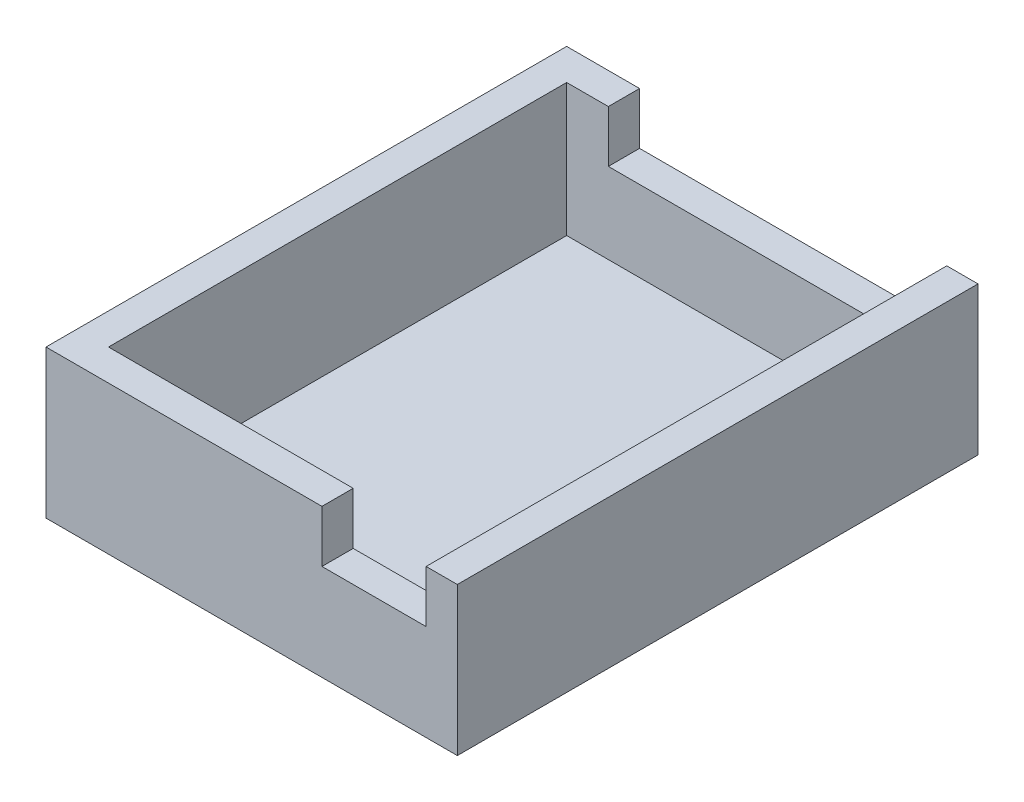
ISO-10303-21;
HEADER;
FILE_DESCRIPTION(('STEP AP214'),'2;1');
FILE_NAME('part.step','',(''),(''),'','','');
FILE_SCHEMA(('AUTOMOTIVE_DESIGN { 1 0 10303 214 1 1 1 1 }'));
ENDSEC;
DATA;
#1=APPLICATION_CONTEXT('core data for automotive mechanical design processes');
#2=APPLICATION_PROTOCOL_DEFINITION('international standard','automotive_design',2000,#1);
#3=PRODUCT_CONTEXT('',#1,'mechanical');
#4=PRODUCT('Part','Part','',(#3));
#5=PRODUCT_RELATED_PRODUCT_CATEGORY('part','',(#4));
#6=PRODUCT_DEFINITION_FORMATION('','',#4);
#7=PRODUCT_DEFINITION_CONTEXT('part definition',#1,'design');
#8=PRODUCT_DEFINITION('design','',#6,#7);
#9=PRODUCT_DEFINITION_SHAPE('','',#8);
#10=(LENGTH_UNIT() NAMED_UNIT(*) SI_UNIT(.MILLI.,.METRE.));
#11=(NAMED_UNIT(*) PLANE_ANGLE_UNIT() SI_UNIT($,.RADIAN.));
#12=(NAMED_UNIT(*) SI_UNIT($,.STERADIAN.) SOLID_ANGLE_UNIT());
#13=UNCERTAINTY_MEASURE_WITH_UNIT(LENGTH_MEASURE(1.E-05),#10,'distance_accuracy_value','');
#14=(GEOMETRIC_REPRESENTATION_CONTEXT(3) GLOBAL_UNCERTAINTY_ASSIGNED_CONTEXT((#13)) GLOBAL_UNIT_ASSIGNED_CONTEXT((#10,
#11,#12)) REPRESENTATION_CONTEXT('',''));
#15=CARTESIAN_POINT('',(0.,0.,0.));
#16=DIRECTION('',(0.,0.,1.));
#17=DIRECTION('',(1.,0.,0.));
#18=AXIS2_PLACEMENT_3D('',#15,#16,#17);
#19=CARTESIAN_POINT('',(0.,14.23,0.));
#20=DIRECTION('',(0.,-1.,0.));
#21=DIRECTION('',(0.,0.,-1.));
#22=AXIS2_PLACEMENT_3D('',#19,#20,#21);
#23=PLANE('',#22);
#24=DIRECTION('',(-1.,0.,0.));
#25=VECTOR('',#24,1.);
#26=CARTESIAN_POINT('',(0.,14.23,-50.));
#27=LINE('',#26,#25);
#28=CARTESIAN_POINT('',(39.5,14.23,-50.));
#29=VERTEX_POINT('',#28);
#30=CARTESIAN_POINT('',(36.5,14.23,-50.));
#31=VERTEX_POINT('',#30);
#32=EDGE_CURVE('E216',#29,#31,#27,.T.);
#33=ORIENTED_EDGE('',*,*,#32,.T.);
#34=DIRECTION('',(0.,0.,-1.));
#35=VECTOR('',#34,1.);
#36=CARTESIAN_POINT('',(36.5,14.23,-3.));
#37=LINE('',#36,#35);
#38=CARTESIAN_POINT('',(36.5,14.23,0.));
#39=VERTEX_POINT('',#38);
#40=EDGE_CURVE('E148',#39,#31,#37,.T.);
#41=ORIENTED_EDGE('',*,*,#40,.F.);
#42=DIRECTION('',(1.,0.,0.));
#43=VECTOR('',#42,1.);
#44=CARTESIAN_POINT('',(0.,14.23,0.));
#45=LINE('',#44,#43);
#46=CARTESIAN_POINT('',(39.5,14.23,0.));
#47=VERTEX_POINT('',#46);
#48=EDGE_CURVE('E208',#39,#47,#45,.T.);
#49=ORIENTED_EDGE('',*,*,#48,.T.);
#50=DIRECTION('',(0.,0.,-1.));
#51=VECTOR('',#50,1.);
#52=CARTESIAN_POINT('',(39.5,14.23,0.));
#53=LINE('',#52,#51);
#54=EDGE_CURVE('E212',#47,#29,#53,.T.);
#55=ORIENTED_EDGE('',*,*,#54,.T.);
#56=EDGE_LOOP('',(#33,#41,#49,#55));
#57=FACE_BOUND('',#56,.T.);
#58=ADVANCED_FACE('F35',(#57),#23,.F.);
#59=CARTESIAN_POINT('',(0.,1.5,0.));
#60=DIRECTION('',(1.,0.,0.));
#61=DIRECTION('',(0.,0.,-1.));
#62=AXIS2_PLACEMENT_3D('',#59,#60,#61);
#63=PLANE('',#62);
#64=DIRECTION('',(0.,0.,1.));
#65=VECTOR('',#64,1.);
#66=CARTESIAN_POINT('',(0.,0.,0.));
#67=LINE('',#66,#65);
#68=CARTESIAN_POINT('',(0.,0.,-50.));
#69=VERTEX_POINT('',#68);
#70=CARTESIAN_POINT('',(0.,0.,0.));
#71=VERTEX_POINT('',#70);
#72=EDGE_CURVE('E218',#69,#71,#67,.T.);
#73=ORIENTED_EDGE('',*,*,#72,.T.);
#74=DIRECTION('',(0.,-1.,0.));
#75=VECTOR('',#74,1.);
#76=CARTESIAN_POINT('',(0.,1.5,0.));
#77=LINE('',#76,#75);
#78=CARTESIAN_POINT('',(0.,14.23,0.));
#79=VERTEX_POINT('',#78);
#80=EDGE_CURVE('E236',#79,#71,#77,.T.);
#81=ORIENTED_EDGE('',*,*,#80,.F.);
#82=DIRECTION('',(0.,0.,1.));
#83=VECTOR('',#82,1.);
#84=CARTESIAN_POINT('',(0.,14.23,0.));
#85=LINE('',#84,#83);
#86=CARTESIAN_POINT('',(0.,14.23,-50.));
#87=VERTEX_POINT('',#86);
#88=EDGE_CURVE('E205',#87,#79,#85,.T.);
#89=ORIENTED_EDGE('',*,*,#88,.F.);
#90=DIRECTION('',(0.,-1.,0.));
#91=VECTOR('',#90,1.);
#92=CARTESIAN_POINT('',(0.,1.5,-50.));
#93=LINE('',#92,#91);
#94=EDGE_CURVE('E227',#87,#69,#93,.T.);
#95=ORIENTED_EDGE('',*,*,#94,.T.);
#96=EDGE_LOOP('',(#73,#81,#89,#95));
#97=FACE_BOUND('',#96,.T.);
#98=ADVANCED_FACE('F37',(#97),#63,.F.);
#99=CARTESIAN_POINT('',(0.,1.5,0.));
#100=DIRECTION('',(0.,0.,-1.));
#101=DIRECTION('',(-1.,0.,0.));
#102=AXIS2_PLACEMENT_3D('',#99,#100,#101);
#103=PLANE('',#102);
#104=DIRECTION('',(1.,0.,0.));
#105=VECTOR('',#104,1.);
#106=CARTESIAN_POINT('',(26.5,9.23,0.));
#107=LINE('',#106,#105);
#108=CARTESIAN_POINT('',(26.5,9.23,0.));
#109=VERTEX_POINT('',#108);
#110=CARTESIAN_POINT('',(36.5,9.23,0.));
#111=VERTEX_POINT('',#110);
#112=EDGE_CURVE('E165',#109,#111,#107,.T.);
#113=ORIENTED_EDGE('',*,*,#112,.F.);
#114=DIRECTION('',(0.,-1.,0.));
#115=VECTOR('',#114,1.);
#116=CARTESIAN_POINT('',(26.5,14.23,0.));
#117=LINE('',#116,#115);
#118=CARTESIAN_POINT('',(26.5,14.23,0.));
#119=VERTEX_POINT('',#118);
#120=EDGE_CURVE('E161',#119,#109,#117,.T.);
#121=ORIENTED_EDGE('',*,*,#120,.F.);
#122=EDGE_CURVE('E209',#79,#119,#45,.T.);
#123=ORIENTED_EDGE('',*,*,#122,.F.);
#124=ORIENTED_EDGE('',*,*,#80,.T.);
#125=DIRECTION('',(1.,0.,0.));
#126=VECTOR('',#125,1.);
#127=CARTESIAN_POINT('',(0.,0.,0.));
#128=LINE('',#127,#126);
#129=CARTESIAN_POINT('',(39.5,0.,0.));
#130=VERTEX_POINT('',#129);
#131=EDGE_CURVE('E221',#71,#130,#128,.T.);
#132=ORIENTED_EDGE('',*,*,#131,.T.);
#133=DIRECTION('',(0.,-1.,0.));
#134=VECTOR('',#133,1.);
#135=CARTESIAN_POINT('',(39.5,1.5,0.));
#136=LINE('',#135,#134);
#137=EDGE_CURVE('E233',#47,#130,#136,.T.);
#138=ORIENTED_EDGE('',*,*,#137,.F.);
#139=ORIENTED_EDGE('',*,*,#48,.F.);
#140=DIRECTION('',(0.,1.,0.));
#141=VECTOR('',#140,1.);
#142=CARTESIAN_POINT('',(36.5,14.23,0.));
#143=LINE('',#142,#141);
#144=EDGE_CURVE('E167',#111,#39,#143,.T.);
#145=ORIENTED_EDGE('',*,*,#144,.F.);
#146=EDGE_LOOP('',(#113,#121,#123,#124,#132,#138,#139,#145));
#147=FACE_BOUND('',#146,.T.);
#148=ADVANCED_FACE('F274',(#147),#103,.F.);
#149=CARTESIAN_POINT('',(39.5,1.5,0.));
#150=DIRECTION('',(-1.,0.,0.));
#151=DIRECTION('',(0.,0.,1.));
#152=AXIS2_PLACEMENT_3D('',#149,#150,#151);
#153=PLANE('',#152);
#154=DIRECTION('',(0.,0.,-1.));
#155=VECTOR('',#154,1.);
#156=CARTESIAN_POINT('',(39.5,0.,0.));
#157=LINE('',#156,#155);
#158=CARTESIAN_POINT('',(39.5,0.,-50.));
#159=VERTEX_POINT('',#158);
#160=EDGE_CURVE('E223',#130,#159,#157,.T.);
#161=ORIENTED_EDGE('',*,*,#160,.T.);
#162=DIRECTION('',(0.,-1.,0.));
#163=VECTOR('',#162,1.);
#164=CARTESIAN_POINT('',(39.5,1.5,-50.));
#165=LINE('',#164,#163);
#166=EDGE_CURVE('E230',#29,#159,#165,.T.);
#167=ORIENTED_EDGE('',*,*,#166,.F.);
#168=ORIENTED_EDGE('',*,*,#54,.F.);
#169=ORIENTED_EDGE('',*,*,#137,.T.);
#170=EDGE_LOOP('',(#161,#167,#168,#169));
#171=FACE_BOUND('',#170,.T.);
#172=ADVANCED_FACE('F286',(#171),#153,.F.);
#173=CARTESIAN_POINT('',(0.,1.5,-50.));
#174=DIRECTION('',(0.,0.,1.));
#175=DIRECTION('',(1.,0.,0.));
#176=AXIS2_PLACEMENT_3D('',#173,#174,#175);
#177=PLANE('',#176);
#178=DIRECTION('',(-1.,0.,0.));
#179=VECTOR('',#178,1.);
#180=CARTESIAN_POINT('',(36.5,9.25,-50.));
#181=LINE('',#180,#179);
#182=CARTESIAN_POINT('',(36.5,9.25,-50.));
#183=VERTEX_POINT('',#182);
#184=CARTESIAN_POINT('',(6.99999999999999,9.25,-50.));
#185=VERTEX_POINT('',#184);
#186=EDGE_CURVE('E137',#183,#185,#181,.T.);
#187=ORIENTED_EDGE('',*,*,#186,.F.);
#188=DIRECTION('',(0.,-1.,0.));
#189=VECTOR('',#188,1.);
#190=CARTESIAN_POINT('',(36.5,14.23,-50.));
#191=LINE('',#190,#189);
#192=EDGE_CURVE('E145',#31,#183,#191,.T.);
#193=ORIENTED_EDGE('',*,*,#192,.F.);
#194=ORIENTED_EDGE('',*,*,#32,.F.);
#195=ORIENTED_EDGE('',*,*,#166,.T.);
#196=DIRECTION('',(-1.,0.,0.));
#197=VECTOR('',#196,1.);
#198=CARTESIAN_POINT('',(0.,0.,-50.));
#199=LINE('',#198,#197);
#200=EDGE_CURVE('E225',#159,#69,#199,.T.);
#201=ORIENTED_EDGE('',*,*,#200,.T.);
#202=ORIENTED_EDGE('',*,*,#94,.F.);
#203=CARTESIAN_POINT('',(6.99999999999999,14.23,-50.));
#204=VERTEX_POINT('',#203);
#205=EDGE_CURVE('E215',#204,#87,#27,.T.);
#206=ORIENTED_EDGE('',*,*,#205,.F.);
#207=DIRECTION('',(0.,1.,0.));
#208=VECTOR('',#207,1.);
#209=CARTESIAN_POINT('',(6.99999999999999,14.23,-50.));
#210=LINE('',#209,#208);
#211=EDGE_CURVE('E142',#185,#204,#210,.T.);
#212=ORIENTED_EDGE('',*,*,#211,.F.);
#213=EDGE_LOOP('',(#187,#193,#194,#195,#201,#202,#206,#212));
#214=FACE_BOUND('',#213,.T.);
#215=ADVANCED_FACE('F153',(#214),#177,.F.);
#216=CARTESIAN_POINT('',(0.,0.,0.));
#217=DIRECTION('',(0.,-1.,0.));
#218=DIRECTION('',(0.,0.,-1.));
#219=AXIS2_PLACEMENT_3D('',#216,#217,#218);
#220=PLANE('',#219);
#221=ORIENTED_EDGE('',*,*,#72,.F.);
#222=ORIENTED_EDGE('',*,*,#200,.F.);
#223=ORIENTED_EDGE('',*,*,#160,.F.);
#224=ORIENTED_EDGE('',*,*,#131,.F.);
#225=EDGE_LOOP('',(#221,#222,#223,#224));
#226=FACE_BOUND('',#225,.T.);
#227=ADVANCED_FACE('F285',(#226),#220,.T.);
#228=DIRECTION('',(-1.,0.,0.));
#229=VECTOR('',#228,1.);
#230=CARTESIAN_POINT('',(3.,14.23,-47.));
#231=LINE('',#230,#229);
#232=CARTESIAN_POINT('',(6.99999999999999,14.23,-47.));
#233=VERTEX_POINT('',#232);
#234=CARTESIAN_POINT('',(3.,14.23,-47.));
#235=VERTEX_POINT('',#234);
#236=EDGE_CURVE('E184',#233,#235,#231,.T.);
#237=ORIENTED_EDGE('',*,*,#236,.F.);
#238=DIRECTION('',(0.,0.,-1.));
#239=VECTOR('',#238,1.);
#240=CARTESIAN_POINT('',(6.99999999999999,14.23,-46.7));
#241=LINE('',#240,#239);
#242=EDGE_CURVE('E158',#233,#204,#241,.T.);
#243=ORIENTED_EDGE('',*,*,#242,.T.);
#244=ORIENTED_EDGE('',*,*,#205,.T.);
#245=ORIENTED_EDGE('',*,*,#88,.T.);
#246=ORIENTED_EDGE('',*,*,#122,.T.);
#247=DIRECTION('',(0.,0.,1.));
#248=VECTOR('',#247,1.);
#249=CARTESIAN_POINT('',(26.5,14.23,-11.2));
#250=LINE('',#249,#248);
#251=CARTESIAN_POINT('',(26.5,14.23,-3.));
#252=VERTEX_POINT('',#251);
#253=EDGE_CURVE('E170',#252,#119,#250,.T.);
#254=ORIENTED_EDGE('',*,*,#253,.F.);
#255=DIRECTION('',(1.,0.,0.));
#256=VECTOR('',#255,1.);
#257=CARTESIAN_POINT('',(3.,14.23,-3.));
#258=LINE('',#257,#256);
#259=CARTESIAN_POINT('',(3.,14.23,-3.));
#260=VERTEX_POINT('',#259);
#261=EDGE_CURVE('E179',#260,#252,#258,.T.);
#262=ORIENTED_EDGE('',*,*,#261,.F.);
#263=DIRECTION('',(0.,0.,1.));
#264=VECTOR('',#263,1.);
#265=CARTESIAN_POINT('',(3.,14.23,-3.));
#266=LINE('',#265,#264);
#267=EDGE_CURVE('E177',#235,#260,#266,.T.);
#268=ORIENTED_EDGE('',*,*,#267,.F.);
#269=EDGE_LOOP('',(#237,#243,#244,#245,#246,#254,#262,#268));
#270=FACE_BOUND('',#269,.T.);
#271=ADVANCED_FACE('F250',(#270),#23,.F.);
#272=CARTESIAN_POINT('',(3.,14.23,-3.));
#273=DIRECTION('',(1.,0.,0.));
#274=DIRECTION('',(0.,0.,-1.));
#275=AXIS2_PLACEMENT_3D('',#272,#273,#274);
#276=PLANE('',#275);
#277=DIRECTION('',(0.,0.,1.));
#278=VECTOR('',#277,1.);
#279=CARTESIAN_POINT('',(3.,1.5,-3.));
#280=LINE('',#279,#278);
#281=CARTESIAN_POINT('',(3.,1.5,-47.));
#282=VERTEX_POINT('',#281);
#283=CARTESIAN_POINT('',(3.,1.5,-3.));
#284=VERTEX_POINT('',#283);
#285=EDGE_CURVE('E176',#282,#284,#280,.T.);
#286=ORIENTED_EDGE('',*,*,#285,.F.);
#287=DIRECTION('',(0.,-1.,0.));
#288=VECTOR('',#287,1.);
#289=CARTESIAN_POINT('',(3.,14.23,-47.));
#290=LINE('',#289,#288);
#291=EDGE_CURVE('E186',#235,#282,#290,.T.);
#292=ORIENTED_EDGE('',*,*,#291,.F.);
#293=ORIENTED_EDGE('',*,*,#267,.T.);
#294=DIRECTION('',(0.,-1.,0.));
#295=VECTOR('',#294,1.);
#296=CARTESIAN_POINT('',(3.,14.23,-3.));
#297=LINE('',#296,#295);
#298=EDGE_CURVE('E202',#260,#284,#297,.T.);
#299=ORIENTED_EDGE('',*,*,#298,.T.);
#300=EDGE_LOOP('',(#286,#292,#293,#299));
#301=FACE_BOUND('',#300,.T.);
#302=ADVANCED_FACE('F257',(#301),#276,.T.);
#303=CARTESIAN_POINT('',(3.,14.23,-3.));
#304=DIRECTION('',(0.,0.,-1.));
#305=DIRECTION('',(-1.,0.,0.));
#306=AXIS2_PLACEMENT_3D('',#303,#304,#305);
#307=PLANE('',#306);
#308=DIRECTION('',(0.,1.,0.));
#309=VECTOR('',#308,1.);
#310=CARTESIAN_POINT('',(26.5,14.23,-3.));
#311=LINE('',#310,#309);
#312=CARTESIAN_POINT('',(26.5,9.23,-3.));
#313=VERTEX_POINT('',#312);
#314=EDGE_CURVE('E239',#313,#252,#311,.T.);
#315=ORIENTED_EDGE('',*,*,#314,.F.);
#316=DIRECTION('',(-1.,0.,0.));
#317=VECTOR('',#316,1.);
#318=CARTESIAN_POINT('',(3.,9.23,-3.));
#319=LINE('',#318,#317);
#320=CARTESIAN_POINT('',(36.5,9.23,-3.));
#321=VERTEX_POINT('',#320);
#322=EDGE_CURVE('E172',#321,#313,#319,.T.);
#323=ORIENTED_EDGE('',*,*,#322,.F.);
#324=DIRECTION('',(0.,-1.,0.));
#325=VECTOR('',#324,1.);
#326=CARTESIAN_POINT('',(36.5,14.23,-3.));
#327=LINE('',#326,#325);
#328=CARTESIAN_POINT('',(36.5,1.5,-3.));
#329=VERTEX_POINT('',#328);
#330=EDGE_CURVE('E200',#321,#329,#327,.T.);
#331=ORIENTED_EDGE('',*,*,#330,.T.);
#332=DIRECTION('',(1.,0.,0.));
#333=VECTOR('',#332,1.);
#334=CARTESIAN_POINT('',(3.,1.5,-3.));
#335=LINE('',#334,#333);
#336=EDGE_CURVE('E189',#284,#329,#335,.T.);
#337=ORIENTED_EDGE('',*,*,#336,.F.);
#338=ORIENTED_EDGE('',*,*,#298,.F.);
#339=ORIENTED_EDGE('',*,*,#261,.T.);
#340=EDGE_LOOP('',(#315,#323,#331,#337,#338,#339));
#341=FACE_BOUND('',#340,.T.);
#342=ADVANCED_FACE('F254',(#341),#307,.T.);
#343=CARTESIAN_POINT('',(36.5,14.23,-3.));
#344=DIRECTION('',(-1.,0.,0.));
#345=DIRECTION('',(0.,0.,1.));
#346=AXIS2_PLACEMENT_3D('',#343,#344,#345);
#347=PLANE('',#346);
#348=DIRECTION('',(0.,0.,-1.));
#349=VECTOR('',#348,1.);
#350=CARTESIAN_POINT('',(36.5,9.25,-46.7));
#351=LINE('',#350,#349);
#352=CARTESIAN_POINT('',(36.5,9.25,-47.));
#353=VERTEX_POINT('',#352);
#354=EDGE_CURVE('E133',#353,#183,#351,.T.);
#355=ORIENTED_EDGE('',*,*,#354,.F.);
#356=DIRECTION('',(0.,-1.,0.));
#357=VECTOR('',#356,1.);
#358=CARTESIAN_POINT('',(36.5,14.23,-47.));
#359=LINE('',#358,#357);
#360=CARTESIAN_POINT('',(36.5,1.5,-47.));
#361=VERTEX_POINT('',#360);
#362=EDGE_CURVE('E198',#353,#361,#359,.T.);
#363=ORIENTED_EDGE('',*,*,#362,.T.);
#364=DIRECTION('',(0.,0.,-1.));
#365=VECTOR('',#364,1.);
#366=CARTESIAN_POINT('',(36.5,1.5,-3.));
#367=LINE('',#366,#365);
#368=EDGE_CURVE('E192',#329,#361,#367,.T.);
#369=ORIENTED_EDGE('',*,*,#368,.F.);
#370=ORIENTED_EDGE('',*,*,#330,.F.);
#371=DIRECTION('',(0.,0.,1.));
#372=VECTOR('',#371,1.);
#373=CARTESIAN_POINT('',(36.5,9.23,-11.2));
#374=LINE('',#373,#372);
#375=EDGE_CURVE('E57',#321,#111,#374,.T.);
#376=ORIENTED_EDGE('',*,*,#375,.T.);
#377=ORIENTED_EDGE('',*,*,#144,.T.);
#378=ORIENTED_EDGE('',*,*,#40,.T.);
#379=ORIENTED_EDGE('',*,*,#192,.T.);
#380=EDGE_LOOP('',(#355,#363,#369,#370,#376,#377,#378,#379));
#381=FACE_BOUND('',#380,.T.);
#382=ADVANCED_FACE('F146',(#381),#347,.T.);
#383=CARTESIAN_POINT('',(3.,14.23,-47.));
#384=DIRECTION('',(0.,0.,1.));
#385=DIRECTION('',(1.,0.,0.));
#386=AXIS2_PLACEMENT_3D('',#383,#384,#385);
#387=PLANE('',#386);
#388=DIRECTION('',(0.,-1.,0.));
#389=VECTOR('',#388,1.);
#390=CARTESIAN_POINT('',(6.99999999999999,14.23,-47.));
#391=LINE('',#390,#389);
#392=CARTESIAN_POINT('',(6.99999999999999,9.25,-47.));
#393=VERTEX_POINT('',#392);
#394=EDGE_CURVE('E11',#233,#393,#391,.T.);
#395=ORIENTED_EDGE('',*,*,#394,.F.);
#396=ORIENTED_EDGE('',*,*,#236,.T.);
#397=ORIENTED_EDGE('',*,*,#291,.T.);
#398=DIRECTION('',(-1.,0.,0.));
#399=VECTOR('',#398,1.);
#400=CARTESIAN_POINT('',(3.,1.5,-47.));
#401=LINE('',#400,#399);
#402=EDGE_CURVE('E180',#361,#282,#401,.T.);
#403=ORIENTED_EDGE('',*,*,#402,.F.);
#404=ORIENTED_EDGE('',*,*,#362,.F.);
#405=DIRECTION('',(1.,0.,0.));
#406=VECTOR('',#405,1.);
#407=CARTESIAN_POINT('',(3.,9.25,-47.));
#408=LINE('',#407,#406);
#409=EDGE_CURVE('E43',#393,#353,#408,.T.);
#410=ORIENTED_EDGE('',*,*,#409,.F.);
#411=EDGE_LOOP('',(#395,#396,#397,#403,#404,#410));
#412=FACE_BOUND('',#411,.T.);
#413=ADVANCED_FACE('F265',(#412),#387,.T.);
#414=CARTESIAN_POINT('',(0.,1.5,0.));
#415=DIRECTION('',(0.,-1.,0.));
#416=DIRECTION('',(0.,0.,-1.));
#417=AXIS2_PLACEMENT_3D('',#414,#415,#416);
#418=PLANE('',#417);
#419=ORIENTED_EDGE('',*,*,#402,.T.);
#420=ORIENTED_EDGE('',*,*,#285,.T.);
#421=ORIENTED_EDGE('',*,*,#336,.T.);
#422=ORIENTED_EDGE('',*,*,#368,.T.);
#423=EDGE_LOOP('',(#419,#420,#421,#422));
#424=FACE_BOUND('',#423,.T.);
#425=ADVANCED_FACE('F260',(#424),#418,.F.);
#426=CARTESIAN_POINT('',(26.5,14.23,-11.2));
#427=DIRECTION('',(-1.,0.,0.));
#428=DIRECTION('',(0.,0.,1.));
#429=AXIS2_PLACEMENT_3D('',#426,#427,#428);
#430=PLANE('',#429);
#431=ORIENTED_EDGE('',*,*,#314,.T.);
#432=ORIENTED_EDGE('',*,*,#253,.T.);
#433=ORIENTED_EDGE('',*,*,#120,.T.);
#434=DIRECTION('',(0.,0.,1.));
#435=VECTOR('',#434,1.);
#436=CARTESIAN_POINT('',(26.5,9.23,-11.2));
#437=LINE('',#436,#435);
#438=EDGE_CURVE('E169',#313,#109,#437,.T.);
#439=ORIENTED_EDGE('',*,*,#438,.F.);
#440=EDGE_LOOP('',(#431,#432,#433,#439));
#441=FACE_BOUND('',#440,.T.);
#442=ADVANCED_FACE('F244',(#441),#430,.F.);
#443=CARTESIAN_POINT('',(26.5,9.23,-11.2));
#444=DIRECTION('',(0.,-1.,0.));
#445=DIRECTION('',(0.,0.,-1.));
#446=AXIS2_PLACEMENT_3D('',#443,#444,#445);
#447=PLANE('',#446);
#448=ORIENTED_EDGE('',*,*,#322,.T.);
#449=ORIENTED_EDGE('',*,*,#438,.T.);
#450=ORIENTED_EDGE('',*,*,#112,.T.);
#451=ORIENTED_EDGE('',*,*,#375,.F.);
#452=EDGE_LOOP('',(#448,#449,#450,#451));
#453=FACE_BOUND('',#452,.T.);
#454=ADVANCED_FACE('F277',(#453),#447,.F.);
#455=CARTESIAN_POINT('',(6.99999999999999,14.23,-46.7));
#456=DIRECTION('',(-1.,0.,0.));
#457=DIRECTION('',(0.,0.,1.));
#458=AXIS2_PLACEMENT_3D('',#455,#456,#457);
#459=PLANE('',#458);
#460=ORIENTED_EDGE('',*,*,#394,.T.);
#461=DIRECTION('',(0.,0.,-1.));
#462=VECTOR('',#461,1.);
#463=CARTESIAN_POINT('',(6.99999999999999,9.25,-46.7));
#464=LINE('',#463,#462);
#465=EDGE_CURVE('E50',#393,#185,#464,.T.);
#466=ORIENTED_EDGE('',*,*,#465,.T.);
#467=ORIENTED_EDGE('',*,*,#211,.T.);
#468=ORIENTED_EDGE('',*,*,#242,.F.);
#469=EDGE_LOOP('',(#460,#466,#467,#468));
#470=FACE_BOUND('',#469,.T.);
#471=ADVANCED_FACE('F349',(#470),#459,.F.);
#472=CARTESIAN_POINT('',(36.5,9.25,-46.7));
#473=DIRECTION('',(0.,-1.,0.));
#474=DIRECTION('',(0.,0.,-1.));
#475=AXIS2_PLACEMENT_3D('',#472,#473,#474);
#476=PLANE('',#475);
#477=ORIENTED_EDGE('',*,*,#409,.T.);
#478=ORIENTED_EDGE('',*,*,#354,.T.);
#479=ORIENTED_EDGE('',*,*,#186,.T.);
#480=ORIENTED_EDGE('',*,*,#465,.F.);
#481=EDGE_LOOP('',(#477,#478,#479,#480));
#482=FACE_BOUND('',#481,.T.);
#483=ADVANCED_FACE('F135',(#482),#476,.F.);
#484=CLOSED_SHELL('',(#58,#98,#148,#172,#215,#227,#271,#302,#342,#382,#413,#425,#442,#454,#471,#483));
#485=MANIFOLD_SOLID_BREP('B2',#484);
#486=ADVANCED_BREP_SHAPE_REPRESENTATION('',(#18,#485),#14);
#487=SHAPE_DEFINITION_REPRESENTATION(#9,#486);
ENDSEC;
END-ISO-10303-21;
